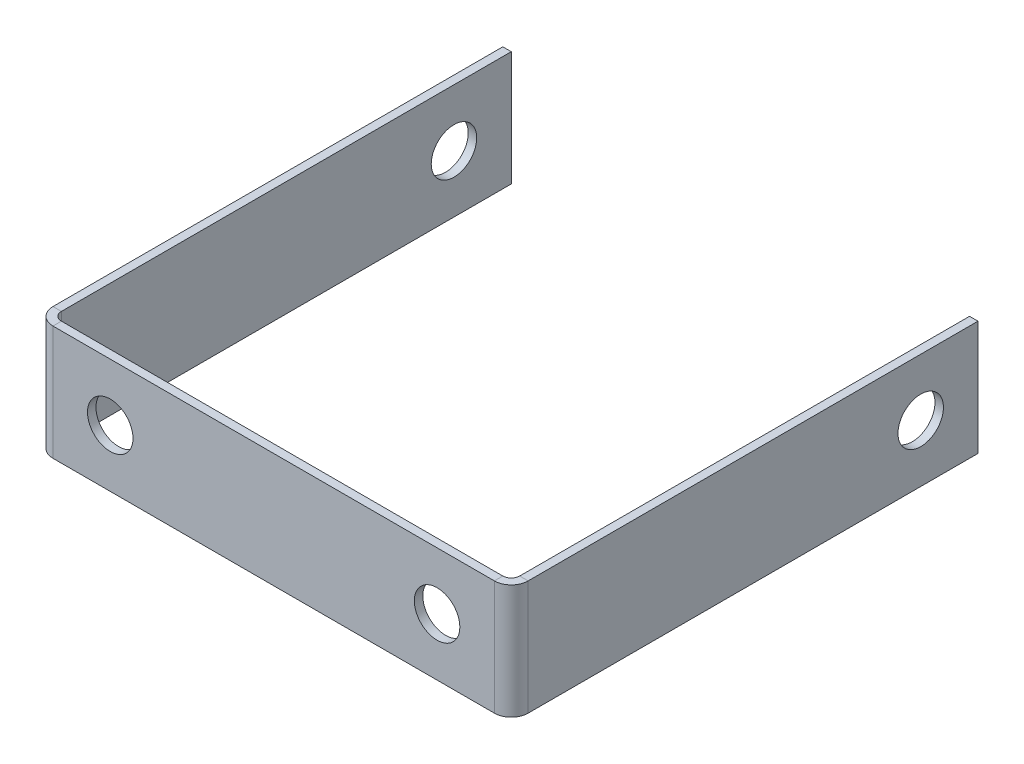
ISO-10303-21;
HEADER;
FILE_DESCRIPTION(('STEP AP214'),'2;1');
FILE_NAME('part.step','',(''),(''),'','','');
FILE_SCHEMA(('AUTOMOTIVE_DESIGN { 1 0 10303 214 1 1 1 1 }'));
ENDSEC;
DATA;
#1=APPLICATION_CONTEXT('core data for automotive mechanical design processes');
#2=APPLICATION_PROTOCOL_DEFINITION('international standard','automotive_design',2000,#1);
#3=PRODUCT_CONTEXT('',#1,'mechanical');
#4=PRODUCT('Part','Part','',(#3));
#5=PRODUCT_RELATED_PRODUCT_CATEGORY('part','',(#4));
#6=PRODUCT_DEFINITION_FORMATION('','',#4);
#7=PRODUCT_DEFINITION_CONTEXT('part definition',#1,'design');
#8=PRODUCT_DEFINITION('design','',#6,#7);
#9=PRODUCT_DEFINITION_SHAPE('','',#8);
#10=(LENGTH_UNIT() NAMED_UNIT(*) SI_UNIT(.MILLI.,.METRE.));
#11=(NAMED_UNIT(*) PLANE_ANGLE_UNIT() SI_UNIT($,.RADIAN.));
#12=(NAMED_UNIT(*) SI_UNIT($,.STERADIAN.) SOLID_ANGLE_UNIT());
#13=UNCERTAINTY_MEASURE_WITH_UNIT(LENGTH_MEASURE(1.E-05),#10,'distance_accuracy_value','');
#14=(GEOMETRIC_REPRESENTATION_CONTEXT(3) GLOBAL_UNCERTAINTY_ASSIGNED_CONTEXT((#13)) GLOBAL_UNIT_ASSIGNED_CONTEXT((#10,
#11,#12)) REPRESENTATION_CONTEXT('',''));
#15=CARTESIAN_POINT('',(0.,0.,0.));
#16=DIRECTION('',(0.,0.,1.));
#17=DIRECTION('',(1.,0.,0.));
#18=AXIS2_PLACEMENT_3D('',#15,#16,#17);
#19=CARTESIAN_POINT('',(0.736599999999997,10.,0.));
#20=DIRECTION('',(0.,1.,0.));
#21=DIRECTION('',(0.,0.,1.));
#22=AXIS2_PLACEMENT_3D('',#19,#20,#21);
#23=PLANE('',#22);
#24=DIRECTION('',(0.,0.,1.));
#25=VECTOR('',#24,1.);
#26=CARTESIAN_POINT('',(0.736599999999997,10.,0.));
#27=LINE('',#26,#25);
#28=CARTESIAN_POINT('',(0.736599999999997,10.,0.));
#29=VERTEX_POINT('',#28);
#30=CARTESIAN_POINT('',(0.736599999999997,10.,0.736600000000004));
#31=VERTEX_POINT('',#30);
#32=EDGE_CURVE('E11',#29,#31,#27,.T.);
#33=ORIENTED_EDGE('',*,*,#32,.F.);
#34=CARTESIAN_POINT('',(0.736599999999997,10.,-0.736600000000004));
#35=DIRECTION('',(0.,-1.,0.));
#36=DIRECTION('',(0.,0.,-1.));
#37=AXIS2_PLACEMENT_3D('',#34,#35,#36);
#38=CIRCLE('',#37,0.7366);
#39=CARTESIAN_POINT('',(0.,10.,-0.736600000000004));
#40=VERTEX_POINT('',#39);
#41=EDGE_CURVE('E249',#40,#29,#38,.F.);
#42=ORIENTED_EDGE('',*,*,#41,.F.);
#43=DIRECTION('',(1.,0.,0.));
#44=VECTOR('',#43,1.);
#45=CARTESIAN_POINT('',(-0.736599999999997,10.,-0.736600000000004));
#46=LINE('',#45,#44);
#47=CARTESIAN_POINT('',(-0.736599999999997,10.,-0.736600000000004));
#48=VERTEX_POINT('',#47);
#49=EDGE_CURVE('E46',#48,#40,#46,.T.);
#50=ORIENTED_EDGE('',*,*,#49,.F.);
#51=CARTESIAN_POINT('',(0.736599999999997,10.,-0.736600000000004));
#52=DIRECTION('',(0.,1.,0.));
#53=DIRECTION('',(1.,0.,0.));
#54=AXIS2_PLACEMENT_3D('',#51,#52,#53);
#55=CIRCLE('',#54,1.4732);
#56=EDGE_CURVE('E147',#48,#31,#55,.T.);
#57=ORIENTED_EDGE('',*,*,#56,.T.);
#58=EDGE_LOOP('',(#33,#42,#50,#57));
#59=FACE_BOUND('',#58,.T.);
#60=ADVANCED_FACE('F38',(#59),#23,.T.);
#61=CARTESIAN_POINT('',(-0.736599999999997,10.,-0.736600000000004));
#62=DIRECTION('',(0.,1.,0.));
#63=DIRECTION('',(0.,0.,1.));
#64=AXIS2_PLACEMENT_3D('',#61,#62,#63);
#65=PLANE('',#64);
#66=DIRECTION('',(1.,0.,0.));
#67=VECTOR('',#66,1.);
#68=CARTESIAN_POINT('',(0.,10.,0.));
#69=LINE('',#68,#67);
#70=CARTESIAN_POINT('',(39.2634,10.,0.));
#71=VERTEX_POINT('',#70);
#72=EDGE_CURVE('E141',#29,#71,#69,.T.);
#73=ORIENTED_EDGE('',*,*,#72,.F.);
#74=ORIENTED_EDGE('',*,*,#32,.T.);
#75=DIRECTION('',(1.,0.,0.));
#76=VECTOR('',#75,1.);
#77=CARTESIAN_POINT('',(0.,10.,0.736600000000004));
#78=LINE('',#77,#76);
#79=CARTESIAN_POINT('',(39.2634,10.,0.736600000000004));
#80=VERTEX_POINT('',#79);
#81=EDGE_CURVE('E138',#31,#80,#78,.T.);
#82=ORIENTED_EDGE('',*,*,#81,.T.);
#83=DIRECTION('',(0.,0.,-1.));
#84=VECTOR('',#83,1.);
#85=CARTESIAN_POINT('',(39.2634,10.,0.736600000000004));
#86=LINE('',#85,#84);
#87=EDGE_CURVE('E230',#80,#71,#86,.T.);
#88=ORIENTED_EDGE('',*,*,#87,.T.);
#89=EDGE_LOOP('',(#73,#74,#82,#88));
#90=FACE_BOUND('',#89,.T.);
#91=ADVANCED_FACE('F136',(#90),#65,.T.);
#92=CARTESIAN_POINT('',(0.,0.,-0.736600000000004));
#93=DIRECTION('',(0.,-1.,0.));
#94=DIRECTION('',(0.,0.,-1.));
#95=AXIS2_PLACEMENT_3D('',#92,#93,#94);
#96=PLANE('',#95);
#97=DIRECTION('',(-1.,0.,0.));
#98=VECTOR('',#97,1.);
#99=CARTESIAN_POINT('',(0.,0.,-0.736600000000004));
#100=LINE('',#99,#98);
#101=CARTESIAN_POINT('',(0.,0.,-0.736600000000004));
#102=VERTEX_POINT('',#101);
#103=CARTESIAN_POINT('',(-0.736599999999997,0.,-0.736600000000004));
#104=VERTEX_POINT('',#103);
#105=EDGE_CURVE('E235',#102,#104,#100,.T.);
#106=ORIENTED_EDGE('',*,*,#105,.F.);
#107=CARTESIAN_POINT('',(0.736599999999997,0.,-0.736600000000004));
#108=DIRECTION('',(0.,-1.,0.));
#109=DIRECTION('',(0.,0.,-1.));
#110=AXIS2_PLACEMENT_3D('',#107,#108,#109);
#111=CIRCLE('',#110,0.7366);
#112=CARTESIAN_POINT('',(0.736599999999997,0.,0.));
#113=VERTEX_POINT('',#112);
#114=EDGE_CURVE('E187',#102,#113,#111,.F.);
#115=ORIENTED_EDGE('',*,*,#114,.T.);
#116=DIRECTION('',(0.,0.,-1.));
#117=VECTOR('',#116,1.);
#118=CARTESIAN_POINT('',(0.736599999999997,0.,0.736600000000004));
#119=LINE('',#118,#117);
#120=CARTESIAN_POINT('',(0.736599999999997,0.,0.736600000000004));
#121=VERTEX_POINT('',#120);
#122=EDGE_CURVE('E233',#121,#113,#119,.T.);
#123=ORIENTED_EDGE('',*,*,#122,.F.);
#124=CARTESIAN_POINT('',(0.736599999999997,0.,-0.736600000000004));
#125=DIRECTION('',(0.,1.,0.));
#126=DIRECTION('',(1.,0.,0.));
#127=AXIS2_PLACEMENT_3D('',#124,#125,#126);
#128=CIRCLE('',#127,1.4732);
#129=EDGE_CURVE('E159',#104,#121,#128,.T.);
#130=ORIENTED_EDGE('',*,*,#129,.F.);
#131=EDGE_LOOP('',(#106,#115,#123,#130));
#132=FACE_BOUND('',#131,.T.);
#133=ADVANCED_FACE('F311',(#132),#96,.T.);
#134=CARTESIAN_POINT('',(0.736599999999997,0.,0.736600000000004));
#135=DIRECTION('',(0.,-1.,0.));
#136=DIRECTION('',(0.,0.,-1.));
#137=AXIS2_PLACEMENT_3D('',#134,#135,#136);
#138=PLANE('',#137);
#139=DIRECTION('',(0.,0.,1.));
#140=VECTOR('',#139,1.);
#141=CARTESIAN_POINT('',(0.,0.,-40.));
#142=LINE('',#141,#140);
#143=CARTESIAN_POINT('',(0.,0.,-40.));
#144=VERTEX_POINT('',#143);
#145=EDGE_CURVE('E190',#144,#102,#142,.T.);
#146=ORIENTED_EDGE('',*,*,#145,.T.);
#147=ORIENTED_EDGE('',*,*,#105,.T.);
#148=DIRECTION('',(0.,0.,1.));
#149=VECTOR('',#148,1.);
#150=CARTESIAN_POINT('',(-0.736600000000004,0.,-40.));
#151=LINE('',#150,#149);
#152=CARTESIAN_POINT('',(-0.736600000000004,0.,-40.));
#153=VERTEX_POINT('',#152);
#154=EDGE_CURVE('E196',#153,#104,#151,.T.);
#155=ORIENTED_EDGE('',*,*,#154,.F.);
#156=DIRECTION('',(1.,0.,0.));
#157=VECTOR('',#156,1.);
#158=CARTESIAN_POINT('',(-0.736600000000004,0.,-40.));
#159=LINE('',#158,#157);
#160=EDGE_CURVE('E193',#153,#144,#159,.T.);
#161=ORIENTED_EDGE('',*,*,#160,.T.);
#162=EDGE_LOOP('',(#146,#147,#155,#161));
#163=FACE_BOUND('',#162,.T.);
#164=ADVANCED_FACE('F315',(#163),#138,.T.);
#165=CARTESIAN_POINT('',(40.,10.,-0.736600000000004));
#166=DIRECTION('',(0.,1.,0.));
#167=DIRECTION('',(0.,0.,1.));
#168=AXIS2_PLACEMENT_3D('',#165,#166,#167);
#169=PLANE('',#168);
#170=DIRECTION('',(1.,0.,0.));
#171=VECTOR('',#170,1.);
#172=CARTESIAN_POINT('',(40.,10.,-0.736600000000004));
#173=LINE('',#172,#171);
#174=CARTESIAN_POINT('',(40.,10.,-0.736600000000004));
#175=VERTEX_POINT('',#174);
#176=CARTESIAN_POINT('',(40.7366,10.,-0.736600000000004));
#177=VERTEX_POINT('',#176);
#178=EDGE_CURVE('E54',#175,#177,#173,.T.);
#179=ORIENTED_EDGE('',*,*,#178,.F.);
#180=CARTESIAN_POINT('',(39.2634,10.,-0.736600000000004));
#181=DIRECTION('',(0.,-1.,0.));
#182=DIRECTION('',(0.,0.,-1.));
#183=AXIS2_PLACEMENT_3D('',#180,#181,#182);
#184=CIRCLE('',#183,0.7366);
#185=EDGE_CURVE('E259',#71,#175,#184,.F.);
#186=ORIENTED_EDGE('',*,*,#185,.F.);
#187=ORIENTED_EDGE('',*,*,#87,.F.);
#188=CARTESIAN_POINT('',(39.2634,10.,-0.736600000000004));
#189=DIRECTION('',(0.,1.,0.));
#190=DIRECTION('',(1.,0.,0.));
#191=AXIS2_PLACEMENT_3D('',#188,#189,#190);
#192=CIRCLE('',#191,1.4732);
#193=EDGE_CURVE('E167',#80,#177,#192,.T.);
#194=ORIENTED_EDGE('',*,*,#193,.T.);
#195=EDGE_LOOP('',(#179,#186,#187,#194));
#196=FACE_BOUND('',#195,.T.);
#197=ADVANCED_FACE('F321',(#196),#169,.T.);
#198=CARTESIAN_POINT('',(39.2634,10.,0.736600000000004));
#199=DIRECTION('',(0.,1.,0.));
#200=DIRECTION('',(0.,0.,1.));
#201=AXIS2_PLACEMENT_3D('',#198,#199,#200);
#202=PLANE('',#201);
#203=DIRECTION('',(0.,0.,-1.));
#204=VECTOR('',#203,1.);
#205=CARTESIAN_POINT('',(40.,10.,0.));
#206=LINE('',#205,#204);
#207=CARTESIAN_POINT('',(40.,10.,-40.));
#208=VERTEX_POINT('',#207);
#209=EDGE_CURVE('E262',#175,#208,#206,.T.);
#210=ORIENTED_EDGE('',*,*,#209,.F.);
#211=ORIENTED_EDGE('',*,*,#178,.T.);
#212=DIRECTION('',(0.,0.,-1.));
#213=VECTOR('',#212,1.);
#214=CARTESIAN_POINT('',(40.7366,10.,0.));
#215=LINE('',#214,#213);
#216=CARTESIAN_POINT('',(40.7366,10.,-40.));
#217=VERTEX_POINT('',#216);
#218=EDGE_CURVE('E108',#177,#217,#215,.T.);
#219=ORIENTED_EDGE('',*,*,#218,.T.);
#220=DIRECTION('',(1.,0.,0.));
#221=VECTOR('',#220,1.);
#222=CARTESIAN_POINT('',(40.,10.,-40.));
#223=LINE('',#222,#221);
#224=EDGE_CURVE('E265',#208,#217,#223,.T.);
#225=ORIENTED_EDGE('',*,*,#224,.F.);
#226=EDGE_LOOP('',(#210,#211,#219,#225));
#227=FACE_BOUND('',#226,.T.);
#228=ADVANCED_FACE('F325',(#227),#202,.T.);
#229=CARTESIAN_POINT('',(39.2634,0.,0.));
#230=DIRECTION('',(0.,-1.,0.));
#231=DIRECTION('',(0.,0.,-1.));
#232=AXIS2_PLACEMENT_3D('',#229,#230,#231);
#233=PLANE('',#232);
#234=DIRECTION('',(0.,0.,1.));
#235=VECTOR('',#234,1.);
#236=CARTESIAN_POINT('',(39.2634,0.,0.));
#237=LINE('',#236,#235);
#238=CARTESIAN_POINT('',(39.2634,0.,0.));
#239=VERTEX_POINT('',#238);
#240=CARTESIAN_POINT('',(39.2634,0.,0.736600000000004));
#241=VERTEX_POINT('',#240);
#242=EDGE_CURVE('E95',#239,#241,#237,.T.);
#243=ORIENTED_EDGE('',*,*,#242,.F.);
#244=CARTESIAN_POINT('',(39.2634,0.,-0.736600000000004));
#245=DIRECTION('',(0.,-1.,0.));
#246=DIRECTION('',(0.,0.,-1.));
#247=AXIS2_PLACEMENT_3D('',#244,#245,#246);
#248=CIRCLE('',#247,0.7366);
#249=CARTESIAN_POINT('',(40.,0.,-0.736600000000004));
#250=VERTEX_POINT('',#249);
#251=EDGE_CURVE('E183',#239,#250,#248,.F.);
#252=ORIENTED_EDGE('',*,*,#251,.T.);
#253=DIRECTION('',(-1.,0.,0.));
#254=VECTOR('',#253,1.);
#255=CARTESIAN_POINT('',(40.7366,0.,-0.736600000000004));
#256=LINE('',#255,#254);
#257=CARTESIAN_POINT('',(40.7366,0.,-0.736600000000004));
#258=VERTEX_POINT('',#257);
#259=EDGE_CURVE('E102',#258,#250,#256,.T.);
#260=ORIENTED_EDGE('',*,*,#259,.F.);
#261=CARTESIAN_POINT('',(39.2634,0.,-0.736600000000004));
#262=DIRECTION('',(0.,1.,0.));
#263=DIRECTION('',(1.,0.,0.));
#264=AXIS2_PLACEMENT_3D('',#261,#262,#263);
#265=CIRCLE('',#264,1.4732);
#266=EDGE_CURVE('E202',#241,#258,#265,.T.);
#267=ORIENTED_EDGE('',*,*,#266,.F.);
#268=EDGE_LOOP('',(#243,#252,#260,#267));
#269=FACE_BOUND('',#268,.T.);
#270=ADVANCED_FACE('F329',(#269),#233,.T.);
#271=CARTESIAN_POINT('',(40.7366,0.,-0.736600000000004));
#272=DIRECTION('',(0.,-1.,0.));
#273=DIRECTION('',(0.,0.,-1.));
#274=AXIS2_PLACEMENT_3D('',#271,#272,#273);
#275=PLANE('',#274);
#276=DIRECTION('',(1.,0.,0.));
#277=VECTOR('',#276,1.);
#278=CARTESIAN_POINT('',(0.,0.,0.));
#279=LINE('',#278,#277);
#280=EDGE_CURVE('E185',#113,#239,#279,.T.);
#281=ORIENTED_EDGE('',*,*,#280,.T.);
#282=ORIENTED_EDGE('',*,*,#242,.T.);
#283=DIRECTION('',(1.,0.,0.));
#284=VECTOR('',#283,1.);
#285=CARTESIAN_POINT('',(0.,0.,0.736600000000004));
#286=LINE('',#285,#284);
#287=EDGE_CURVE('E200',#121,#241,#286,.T.);
#288=ORIENTED_EDGE('',*,*,#287,.F.);
#289=ORIENTED_EDGE('',*,*,#122,.T.);
#290=EDGE_LOOP('',(#281,#282,#288,#289));
#291=FACE_BOUND('',#290,.T.);
#292=ADVANCED_FACE('F332',(#291),#275,.T.);
#293=CARTESIAN_POINT('',(40.7366,10.,0.));
#294=DIRECTION('',(-1.,0.,0.));
#295=DIRECTION('',(0.,0.,1.));
#296=AXIS2_PLACEMENT_3D('',#293,#294,#295);
#297=PLANE('',#296);
#298=CARTESIAN_POINT('',(40.7366,5.,-35.));
#299=DIRECTION('',(-1.,0.,0.));
#300=DIRECTION('',(0.,0.,1.));
#301=AXIS2_PLACEMENT_3D('',#298,#299,#300);
#302=CIRCLE('',#301,1.984375);
#303=CARTESIAN_POINT('',(40.7366,5.,-33.015625));
#304=VERTEX_POINT('',#303);
#305=EDGE_CURVE('E286',#304,#304,#302,.T.);
#306=ORIENTED_EDGE('',*,*,#305,.T.);
#307=EDGE_LOOP('',(#306));
#308=FACE_BOUND('',#307,.T.);
#309=DIRECTION('',(0.,0.,-1.));
#310=VECTOR('',#309,1.);
#311=CARTESIAN_POINT('',(40.7366,0.,0.));
#312=LINE('',#311,#310);
#313=CARTESIAN_POINT('',(40.7366,0.,-40.));
#314=VERTEX_POINT('',#313);
#315=EDGE_CURVE('E173',#258,#314,#312,.T.);
#316=ORIENTED_EDGE('',*,*,#315,.T.);
#317=DIRECTION('',(0.,-1.,0.));
#318=VECTOR('',#317,1.);
#319=CARTESIAN_POINT('',(40.7366,10.,-40.));
#320=LINE('',#319,#318);
#321=EDGE_CURVE('E226',#217,#314,#320,.T.);
#322=ORIENTED_EDGE('',*,*,#321,.F.);
#323=ORIENTED_EDGE('',*,*,#218,.F.);
#324=DIRECTION('',(0.,-1.,0.));
#325=VECTOR('',#324,1.);
#326=CARTESIAN_POINT('',(40.7366,10.,-0.736600000000004));
#327=LINE('',#326,#325);
#328=EDGE_CURVE('E169',#177,#258,#327,.T.);
#329=ORIENTED_EDGE('',*,*,#328,.T.);
#330=EDGE_LOOP('',(#316,#322,#323,#329));
#331=FACE_BOUND('',#330,.T.);
#332=ADVANCED_FACE('F293',(#308,#331),#297,.F.);
#333=CARTESIAN_POINT('',(40.,10.,-40.));
#334=DIRECTION('',(0.,0.,-1.));
#335=DIRECTION('',(-1.,0.,0.));
#336=AXIS2_PLACEMENT_3D('',#333,#334,#335);
#337=PLANE('',#336);
#338=DIRECTION('',(1.,0.,0.));
#339=VECTOR('',#338,1.);
#340=CARTESIAN_POINT('',(40.,0.,-40.));
#341=LINE('',#340,#339);
#342=CARTESIAN_POINT('',(40.,0.,-40.));
#343=VERTEX_POINT('',#342);
#344=EDGE_CURVE('E176',#343,#314,#341,.T.);
#345=ORIENTED_EDGE('',*,*,#344,.F.);
#346=DIRECTION('',(0.,-1.,0.));
#347=VECTOR('',#346,1.);
#348=CARTESIAN_POINT('',(40.,10.,-40.));
#349=LINE('',#348,#347);
#350=EDGE_CURVE('E224',#208,#343,#349,.T.);
#351=ORIENTED_EDGE('',*,*,#350,.F.);
#352=ORIENTED_EDGE('',*,*,#224,.T.);
#353=ORIENTED_EDGE('',*,*,#321,.T.);
#354=EDGE_LOOP('',(#345,#351,#352,#353));
#355=FACE_BOUND('',#354,.T.);
#356=ADVANCED_FACE('F337',(#355),#337,.T.);
#357=CARTESIAN_POINT('',(40.,10.,0.));
#358=DIRECTION('',(-1.,0.,0.));
#359=DIRECTION('',(0.,0.,1.));
#360=AXIS2_PLACEMENT_3D('',#357,#358,#359);
#361=PLANE('',#360);
#362=CARTESIAN_POINT('',(40.,5.,-35.));
#363=DIRECTION('',(-1.,0.,0.));
#364=DIRECTION('',(0.,0.,1.));
#365=AXIS2_PLACEMENT_3D('',#362,#363,#364);
#366=CIRCLE('',#365,1.984375);
#367=CARTESIAN_POINT('',(40.,5.,-33.015625));
#368=VERTEX_POINT('',#367);
#369=EDGE_CURVE('E280',#368,#368,#366,.T.);
#370=ORIENTED_EDGE('',*,*,#369,.F.);
#371=EDGE_LOOP('',(#370));
#372=FACE_BOUND('',#371,.T.);
#373=DIRECTION('',(0.,0.,-1.));
#374=VECTOR('',#373,1.);
#375=CARTESIAN_POINT('',(40.,0.,0.));
#376=LINE('',#375,#374);
#377=EDGE_CURVE('E180',#250,#343,#376,.T.);
#378=ORIENTED_EDGE('',*,*,#377,.F.);
#379=DIRECTION('',(0.,-1.,0.));
#380=VECTOR('',#379,1.);
#381=CARTESIAN_POINT('',(40.,10.,-0.736600000000004));
#382=LINE('',#381,#380);
#383=EDGE_CURVE('E221',#175,#250,#382,.T.);
#384=ORIENTED_EDGE('',*,*,#383,.F.);
#385=ORIENTED_EDGE('',*,*,#209,.T.);
#386=ORIENTED_EDGE('',*,*,#350,.T.);
#387=EDGE_LOOP('',(#378,#384,#385,#386));
#388=FACE_BOUND('',#387,.T.);
#389=ADVANCED_FACE('F340',(#372,#388),#361,.T.);
#390=CARTESIAN_POINT('',(39.2634,10.,-0.736600000000004));
#391=DIRECTION('',(0.,-1.,0.));
#392=DIRECTION('',(0.,0.,-1.));
#393=AXIS2_PLACEMENT_3D('',#390,#391,#392);
#394=CYLINDRICAL_SURFACE('',#393,0.7366);
#395=ORIENTED_EDGE('',*,*,#251,.F.);
#396=DIRECTION('',(0.,-1.,0.));
#397=VECTOR('',#396,1.);
#398=CARTESIAN_POINT('',(39.2634,10.,0.));
#399=LINE('',#398,#397);
#400=EDGE_CURVE('E218',#71,#239,#399,.T.);
#401=ORIENTED_EDGE('',*,*,#400,.F.);
#402=ORIENTED_EDGE('',*,*,#185,.T.);
#403=ORIENTED_EDGE('',*,*,#383,.T.);
#404=EDGE_LOOP('',(#395,#401,#402,#403));
#405=FACE_BOUND('',#404,.T.);
#406=ADVANCED_FACE('F344',(#405),#394,.F.);
#407=CARTESIAN_POINT('',(0.,10.,0.));
#408=DIRECTION('',(0.,0.,-1.));
#409=DIRECTION('',(-1.,0.,0.));
#410=AXIS2_PLACEMENT_3D('',#407,#408,#409);
#411=PLANE('',#410);
#412=CARTESIAN_POINT('',(34.2634,5.,0.));
#413=DIRECTION('',(0.,0.,-1.));
#414=DIRECTION('',(-1.,0.,0.));
#415=AXIS2_PLACEMENT_3D('',#412,#413,#414);
#416=CIRCLE('',#415,1.984375);
#417=CARTESIAN_POINT('',(32.279025,5.,0.));
#418=VERTEX_POINT('',#417);
#419=EDGE_CURVE('E274',#418,#418,#416,.T.);
#420=ORIENTED_EDGE('',*,*,#419,.F.);
#421=EDGE_LOOP('',(#420));
#422=FACE_BOUND('',#421,.T.);
#423=CARTESIAN_POINT('',(5.7366,5.,0.));
#424=DIRECTION('',(0.,0.,-1.));
#425=DIRECTION('',(-1.,0.,0.));
#426=AXIS2_PLACEMENT_3D('',#423,#424,#425);
#427=CIRCLE('',#426,1.984375);
#428=CARTESIAN_POINT('',(3.752225,5.,0.));
#429=VERTEX_POINT('',#428);
#430=EDGE_CURVE('E177',#429,#429,#427,.T.);
#431=ORIENTED_EDGE('',*,*,#430,.F.);
#432=EDGE_LOOP('',(#431));
#433=FACE_BOUND('',#432,.T.);
#434=ORIENTED_EDGE('',*,*,#280,.F.);
#435=DIRECTION('',(0.,-1.,0.));
#436=VECTOR('',#435,1.);
#437=CARTESIAN_POINT('',(0.736599999999997,10.,0.));
#438=LINE('',#437,#436);
#439=EDGE_CURVE('E215',#29,#113,#438,.T.);
#440=ORIENTED_EDGE('',*,*,#439,.F.);
#441=ORIENTED_EDGE('',*,*,#72,.T.);
#442=ORIENTED_EDGE('',*,*,#400,.T.);
#443=EDGE_LOOP('',(#434,#440,#441,#442));
#444=FACE_BOUND('',#443,.T.);
#445=ADVANCED_FACE('F348',(#422,#433,#444),#411,.T.);
#446=CARTESIAN_POINT('',(0.736599999999997,10.,-0.736600000000004));
#447=DIRECTION('',(0.,-1.,0.));
#448=DIRECTION('',(0.,0.,-1.));
#449=AXIS2_PLACEMENT_3D('',#446,#447,#448);
#450=CYLINDRICAL_SURFACE('',#449,0.7366);
#451=ORIENTED_EDGE('',*,*,#114,.F.);
#452=DIRECTION('',(0.,-1.,0.));
#453=VECTOR('',#452,1.);
#454=CARTESIAN_POINT('',(0.,10.,-0.736600000000004));
#455=LINE('',#454,#453);
#456=EDGE_CURVE('E212',#40,#102,#455,.T.);
#457=ORIENTED_EDGE('',*,*,#456,.F.);
#458=ORIENTED_EDGE('',*,*,#41,.T.);
#459=ORIENTED_EDGE('',*,*,#439,.T.);
#460=EDGE_LOOP('',(#451,#457,#458,#459));
#461=FACE_BOUND('',#460,.T.);
#462=ADVANCED_FACE('F248',(#461),#450,.F.);
#463=CARTESIAN_POINT('',(0.,10.,-40.));
#464=DIRECTION('',(1.,0.,0.));
#465=DIRECTION('',(0.,0.,-1.));
#466=AXIS2_PLACEMENT_3D('',#463,#464,#465);
#467=PLANE('',#466);
#468=CARTESIAN_POINT('',(0.,5.,-35.));
#469=DIRECTION('',(1.,0.,0.));
#470=DIRECTION('',(0.,0.,-1.));
#471=AXIS2_PLACEMENT_3D('',#468,#469,#470);
#472=CIRCLE('',#471,1.984375);
#473=CARTESIAN_POINT('',(0.,5.,-36.984375));
#474=VERTEX_POINT('',#473);
#475=EDGE_CURVE('E283',#474,#474,#472,.T.);
#476=ORIENTED_EDGE('',*,*,#475,.F.);
#477=EDGE_LOOP('',(#476));
#478=FACE_BOUND('',#477,.T.);
#479=ORIENTED_EDGE('',*,*,#145,.F.);
#480=DIRECTION('',(0.,-1.,0.));
#481=VECTOR('',#480,1.);
#482=CARTESIAN_POINT('',(0.,10.,-40.));
#483=LINE('',#482,#481);
#484=CARTESIAN_POINT('',(0.,10.,-40.));
#485=VERTEX_POINT('',#484);
#486=EDGE_CURVE('E210',#485,#144,#483,.T.);
#487=ORIENTED_EDGE('',*,*,#486,.F.);
#488=DIRECTION('',(0.,0.,1.));
#489=VECTOR('',#488,1.);
#490=CARTESIAN_POINT('',(0.,10.,-40.));
#491=LINE('',#490,#489);
#492=EDGE_CURVE('E242',#485,#40,#491,.T.);
#493=ORIENTED_EDGE('',*,*,#492,.T.);
#494=ORIENTED_EDGE('',*,*,#456,.T.);
#495=EDGE_LOOP('',(#479,#487,#493,#494));
#496=FACE_BOUND('',#495,.T.);
#497=ADVANCED_FACE('F253',(#478,#496),#467,.T.);
#498=CARTESIAN_POINT('',(-0.736600000000004,10.,-40.));
#499=DIRECTION('',(0.,0.,-1.));
#500=DIRECTION('',(-1.,0.,0.));
#501=AXIS2_PLACEMENT_3D('',#498,#499,#500);
#502=PLANE('',#501);
#503=ORIENTED_EDGE('',*,*,#160,.F.);
#504=DIRECTION('',(0.,-1.,0.));
#505=VECTOR('',#504,1.);
#506=CARTESIAN_POINT('',(-0.736600000000004,10.,-40.));
#507=LINE('',#506,#505);
#508=CARTESIAN_POINT('',(-0.736600000000004,10.,-40.));
#509=VERTEX_POINT('',#508);
#510=EDGE_CURVE('E208',#509,#153,#507,.T.);
#511=ORIENTED_EDGE('',*,*,#510,.F.);
#512=DIRECTION('',(1.,0.,0.));
#513=VECTOR('',#512,1.);
#514=CARTESIAN_POINT('',(-0.736600000000004,10.,-40.));
#515=LINE('',#514,#513);
#516=EDGE_CURVE('E254',#509,#485,#515,.T.);
#517=ORIENTED_EDGE('',*,*,#516,.T.);
#518=ORIENTED_EDGE('',*,*,#486,.T.);
#519=EDGE_LOOP('',(#503,#511,#517,#518));
#520=FACE_BOUND('',#519,.T.);
#521=ADVANCED_FACE('F357',(#520),#502,.T.);
#522=CARTESIAN_POINT('',(-0.736600000000004,10.,-40.));
#523=DIRECTION('',(1.,0.,0.));
#524=DIRECTION('',(0.,0.,-1.));
#525=AXIS2_PLACEMENT_3D('',#522,#523,#524);
#526=PLANE('',#525);
#527=CARTESIAN_POINT('',(-0.736600000000004,5.,-35.));
#528=DIRECTION('',(-1.,0.,0.));
#529=DIRECTION('',(0.,0.,1.));
#530=AXIS2_PLACEMENT_3D('',#527,#528,#529);
#531=CIRCLE('',#530,1.984375);
#532=CARTESIAN_POINT('',(-0.736600000000004,5.,-33.015625));
#533=VERTEX_POINT('',#532);
#534=EDGE_CURVE('E287',#533,#533,#531,.T.);
#535=ORIENTED_EDGE('',*,*,#534,.F.);
#536=EDGE_LOOP('',(#535));
#537=FACE_BOUND('',#536,.T.);
#538=ORIENTED_EDGE('',*,*,#154,.T.);
#539=DIRECTION('',(0.,-1.,0.));
#540=VECTOR('',#539,1.);
#541=CARTESIAN_POINT('',(-0.736599999999997,10.,-0.736600000000004));
#542=LINE('',#541,#540);
#543=EDGE_CURVE('E161',#48,#104,#542,.T.);
#544=ORIENTED_EDGE('',*,*,#543,.F.);
#545=DIRECTION('',(0.,0.,1.));
#546=VECTOR('',#545,1.);
#547=CARTESIAN_POINT('',(-0.736600000000004,10.,-40.));
#548=LINE('',#547,#546);
#549=EDGE_CURVE('E152',#509,#48,#548,.T.);
#550=ORIENTED_EDGE('',*,*,#549,.F.);
#551=ORIENTED_EDGE('',*,*,#510,.T.);
#552=EDGE_LOOP('',(#538,#544,#550,#551));
#553=FACE_BOUND('',#552,.T.);
#554=ADVANCED_FACE('F361',(#537,#553),#526,.F.);
#555=CARTESIAN_POINT('',(0.736599999999997,10.,-0.736600000000004));
#556=DIRECTION('',(0.,-1.,0.));
#557=DIRECTION('',(0.,0.,-1.));
#558=AXIS2_PLACEMENT_3D('',#555,#556,#557);
#559=CYLINDRICAL_SURFACE('',#558,1.4732);
#560=ORIENTED_EDGE('',*,*,#129,.T.);
#561=DIRECTION('',(0.,-1.,0.));
#562=VECTOR('',#561,1.);
#563=CARTESIAN_POINT('',(0.736599999999997,10.,0.736600000000004));
#564=LINE('',#563,#562);
#565=EDGE_CURVE('E156',#31,#121,#564,.T.);
#566=ORIENTED_EDGE('',*,*,#565,.F.);
#567=ORIENTED_EDGE('',*,*,#56,.F.);
#568=ORIENTED_EDGE('',*,*,#543,.T.);
#569=EDGE_LOOP('',(#560,#566,#567,#568));
#570=FACE_BOUND('',#569,.T.);
#571=ADVANCED_FACE('F157',(#570),#559,.T.);
#572=CARTESIAN_POINT('',(0.,10.,0.736600000000004));
#573=DIRECTION('',(0.,0.,-1.));
#574=DIRECTION('',(-1.,0.,0.));
#575=AXIS2_PLACEMENT_3D('',#572,#573,#574);
#576=PLANE('',#575);
#577=CARTESIAN_POINT('',(34.2634,5.,0.736600000000004));
#578=DIRECTION('',(0.,0.,1.));
#579=DIRECTION('',(1.,0.,0.));
#580=AXIS2_PLACEMENT_3D('',#577,#578,#579);
#581=CIRCLE('',#580,1.984375);
#582=CARTESIAN_POINT('',(36.247775,5.,0.736600000000004));
#583=VERTEX_POINT('',#582);
#584=EDGE_CURVE('E277',#583,#583,#581,.T.);
#585=ORIENTED_EDGE('',*,*,#584,.F.);
#586=EDGE_LOOP('',(#585));
#587=FACE_BOUND('',#586,.T.);
#588=CARTESIAN_POINT('',(5.7366,5.,0.736600000000004));
#589=DIRECTION('',(0.,0.,1.));
#590=DIRECTION('',(1.,0.,0.));
#591=AXIS2_PLACEMENT_3D('',#588,#589,#590);
#592=CIRCLE('',#591,1.984375);
#593=CARTESIAN_POINT('',(7.720975,5.,0.736600000000004));
#594=VERTEX_POINT('',#593);
#595=EDGE_CURVE('E271',#594,#594,#592,.T.);
#596=ORIENTED_EDGE('',*,*,#595,.F.);
#597=EDGE_LOOP('',(#596));
#598=FACE_BOUND('',#597,.T.);
#599=ORIENTED_EDGE('',*,*,#287,.T.);
#600=DIRECTION('',(0.,-1.,0.));
#601=VECTOR('',#600,1.);
#602=CARTESIAN_POINT('',(39.2634,10.,0.736600000000004));
#603=LINE('',#602,#601);
#604=EDGE_CURVE('E162',#80,#241,#603,.T.);
#605=ORIENTED_EDGE('',*,*,#604,.F.);
#606=ORIENTED_EDGE('',*,*,#81,.F.);
#607=ORIENTED_EDGE('',*,*,#565,.T.);
#608=EDGE_LOOP('',(#599,#605,#606,#607));
#609=FACE_BOUND('',#608,.T.);
#610=ADVANCED_FACE('F164',(#587,#598,#609),#576,.F.);
#611=CARTESIAN_POINT('',(39.2634,10.,-0.736600000000004));
#612=DIRECTION('',(0.,-1.,0.));
#613=DIRECTION('',(0.,0.,-1.));
#614=AXIS2_PLACEMENT_3D('',#611,#612,#613);
#615=CYLINDRICAL_SURFACE('',#614,1.4732);
#616=ORIENTED_EDGE('',*,*,#266,.T.);
#617=ORIENTED_EDGE('',*,*,#328,.F.);
#618=ORIENTED_EDGE('',*,*,#193,.F.);
#619=ORIENTED_EDGE('',*,*,#604,.T.);
#620=EDGE_LOOP('',(#616,#617,#618,#619));
#621=FACE_BOUND('',#620,.T.);
#622=ADVANCED_FACE('F370',(#621),#615,.T.);
#623=CARTESIAN_POINT('',(39.2634,10.,-0.736600000000004));
#624=DIRECTION('',(0.,-1.,0.));
#625=DIRECTION('',(-1.,0.,0.));
#626=AXIS2_PLACEMENT_3D('',#623,#624,#625);
#627=PLANE('',#626);
#628=ORIENTED_EDGE('',*,*,#549,.T.);
#629=ORIENTED_EDGE('',*,*,#49,.T.);
#630=ORIENTED_EDGE('',*,*,#492,.F.);
#631=ORIENTED_EDGE('',*,*,#516,.F.);
#632=EDGE_LOOP('',(#628,#629,#630,#631));
#633=FACE_BOUND('',#632,.T.);
#634=ADVANCED_FACE('F239',(#633),#627,.F.);
#635=CARTESIAN_POINT('',(39.2634,0.,-0.736600000000004));
#636=DIRECTION('',(0.,-1.,0.));
#637=DIRECTION('',(-1.,0.,0.));
#638=AXIS2_PLACEMENT_3D('',#635,#636,#637);
#639=PLANE('',#638);
#640=ORIENTED_EDGE('',*,*,#315,.F.);
#641=ORIENTED_EDGE('',*,*,#259,.T.);
#642=ORIENTED_EDGE('',*,*,#377,.T.);
#643=ORIENTED_EDGE('',*,*,#344,.T.);
#644=EDGE_LOOP('',(#640,#641,#642,#643));
#645=FACE_BOUND('',#644,.T.);
#646=ADVANCED_FACE('F375',(#645),#639,.T.);
#647=CARTESIAN_POINT('',(5.7366,5.,-9.2634));
#648=DIRECTION('',(0.,0.,1.));
#649=DIRECTION('',(1.,0.,0.));
#650=AXIS2_PLACEMENT_3D('',#647,#648,#649);
#651=CYLINDRICAL_SURFACE('',#650,1.984375);
#652=ORIENTED_EDGE('',*,*,#430,.T.);
#653=EDGE_LOOP('',(#652));
#654=FACE_BOUND('',#653,.T.);
#655=ORIENTED_EDGE('',*,*,#595,.T.);
#656=EDGE_LOOP('',(#655));
#657=FACE_BOUND('',#656,.T.);
#658=ADVANCED_FACE('F378',(#654,#657),#651,.F.);
#659=CARTESIAN_POINT('',(34.2634,5.,-9.2634));
#660=DIRECTION('',(0.,0.,1.));
#661=DIRECTION('',(1.,0.,0.));
#662=AXIS2_PLACEMENT_3D('',#659,#660,#661);
#663=CYLINDRICAL_SURFACE('',#662,1.984375);
#664=ORIENTED_EDGE('',*,*,#419,.T.);
#665=EDGE_LOOP('',(#664));
#666=FACE_BOUND('',#665,.T.);
#667=ORIENTED_EDGE('',*,*,#584,.T.);
#668=EDGE_LOOP('',(#667));
#669=FACE_BOUND('',#668,.T.);
#670=ADVANCED_FACE('F304',(#666,#669),#663,.F.);
#671=CARTESIAN_POINT('',(40.7366,5.,-35.));
#672=DIRECTION('',(-1.,0.,0.));
#673=DIRECTION('',(0.,0.,1.));
#674=AXIS2_PLACEMENT_3D('',#671,#672,#673);
#675=CYLINDRICAL_SURFACE('',#674,1.984375);
#676=ORIENTED_EDGE('',*,*,#475,.T.);
#677=EDGE_LOOP('',(#676));
#678=FACE_BOUND('',#677,.T.);
#679=ORIENTED_EDGE('',*,*,#534,.T.);
#680=EDGE_LOOP('',(#679));
#681=FACE_BOUND('',#680,.T.);
#682=ADVANCED_FACE('F298',(#678,#681),#675,.F.);
#683=ORIENTED_EDGE('',*,*,#369,.T.);
#684=EDGE_LOOP('',(#683));
#685=FACE_BOUND('',#684,.T.);
#686=ORIENTED_EDGE('',*,*,#305,.F.);
#687=EDGE_LOOP('',(#686));
#688=FACE_BOUND('',#687,.T.);
#689=ADVANCED_FACE('F296',(#685,#688),#675,.F.);
#690=CLOSED_SHELL('',(#60,#91,#133,#164,#197,#228,#270,#292,#332,#356,#389,#406,#445,#462,#497,
#521,#554,#571,#610,#622,#634,#646,#658,#670,#682,#689));
#691=MANIFOLD_SOLID_BREP('B2',#690);
#692=ADVANCED_BREP_SHAPE_REPRESENTATION('',(#18,#691),#14);
#693=SHAPE_DEFINITION_REPRESENTATION(#9,#692);
ENDSEC;
END-ISO-10303-21;
